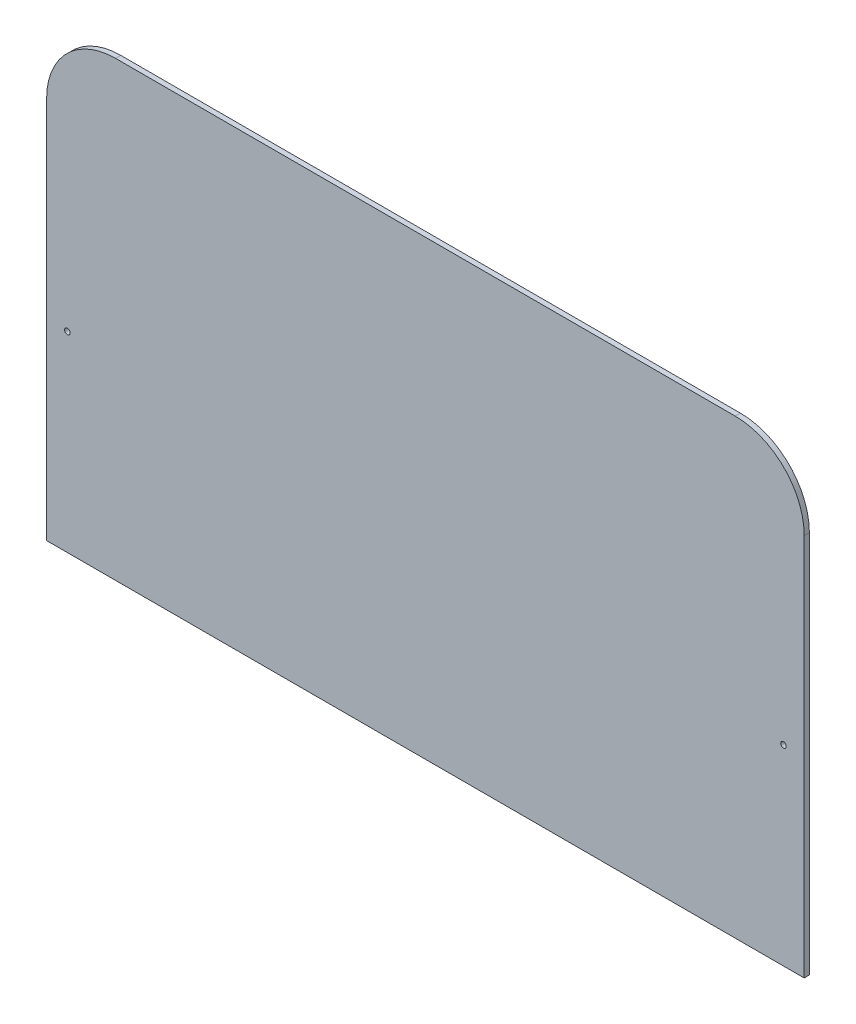
ISO-10303-21;
HEADER;
FILE_DESCRIPTION(('STEP AP214'),'2;1');
FILE_NAME('part.step','',(''),(''),'','','');
FILE_SCHEMA(('AUTOMOTIVE_DESIGN { 1 0 10303 214 1 1 1 1 }'));
ENDSEC;
DATA;
#1=APPLICATION_CONTEXT('core data for automotive mechanical design processes');
#2=APPLICATION_PROTOCOL_DEFINITION('international standard','automotive_design',2000,#1);
#3=PRODUCT_CONTEXT('',#1,'mechanical');
#4=PRODUCT('Part','Part','',(#3));
#5=PRODUCT_RELATED_PRODUCT_CATEGORY('part','',(#4));
#6=PRODUCT_DEFINITION_FORMATION('','',#4);
#7=PRODUCT_DEFINITION_CONTEXT('part definition',#1,'design');
#8=PRODUCT_DEFINITION('design','',#6,#7);
#9=PRODUCT_DEFINITION_SHAPE('','',#8);
#10=(LENGTH_UNIT() NAMED_UNIT(*) SI_UNIT(.MILLI.,.METRE.));
#11=(NAMED_UNIT(*) PLANE_ANGLE_UNIT() SI_UNIT($,.RADIAN.));
#12=(NAMED_UNIT(*) SI_UNIT($,.STERADIAN.) SOLID_ANGLE_UNIT());
#13=UNCERTAINTY_MEASURE_WITH_UNIT(LENGTH_MEASURE(1.E-05),#10,'distance_accuracy_value','');
#14=(GEOMETRIC_REPRESENTATION_CONTEXT(3) GLOBAL_UNCERTAINTY_ASSIGNED_CONTEXT((#13)) GLOBAL_UNIT_ASSIGNED_CONTEXT((#10,
#11,#12)) REPRESENTATION_CONTEXT('',''));
#15=CARTESIAN_POINT('',(0.,0.,0.));
#16=DIRECTION('',(0.,0.,1.));
#17=DIRECTION('',(1.,0.,0.));
#18=AXIS2_PLACEMENT_3D('',#15,#16,#17);
#19=CARTESIAN_POINT('',(-219.5,-131.,3.));
#20=DIRECTION('',(1.,0.,0.));
#21=DIRECTION('',(0.,0.,-1.));
#22=AXIS2_PLACEMENT_3D('',#19,#20,#21);
#23=PLANE('',#22);
#24=DIRECTION('',(0.,-1.,0.));
#25=VECTOR('',#24,1.);
#26=CARTESIAN_POINT('',(-219.5,-131.,3.));
#27=LINE('',#26,#25);
#28=CARTESIAN_POINT('',(-219.5,91.0000000000001,3.));
#29=VERTEX_POINT('',#28);
#30=CARTESIAN_POINT('',(-219.5,-131.,3.));
#31=VERTEX_POINT('',#30);
#32=EDGE_CURVE('E86',#29,#31,#27,.T.);
#33=ORIENTED_EDGE('',*,*,#32,.F.);
#34=DIRECTION('',(0.,0.,-1.));
#35=VECTOR('',#34,1.);
#36=CARTESIAN_POINT('',(-219.5,91.0000000000001,3.));
#37=LINE('',#36,#35);
#38=CARTESIAN_POINT('',(-219.5,91.0000000000001,0.));
#39=VERTEX_POINT('',#38);
#40=EDGE_CURVE('E11',#29,#39,#37,.T.);
#41=ORIENTED_EDGE('',*,*,#40,.T.);
#42=DIRECTION('',(0.,-1.,0.));
#43=VECTOR('',#42,1.);
#44=CARTESIAN_POINT('',(-219.5,-131.,0.));
#45=LINE('',#44,#43);
#46=CARTESIAN_POINT('',(-219.5,-131.,0.));
#47=VERTEX_POINT('',#46);
#48=EDGE_CURVE('E105',#39,#47,#45,.T.);
#49=ORIENTED_EDGE('',*,*,#48,.T.);
#50=DIRECTION('',(0.,0.,-1.));
#51=VECTOR('',#50,1.);
#52=CARTESIAN_POINT('',(-219.5,-131.,3.));
#53=LINE('',#52,#51);
#54=EDGE_CURVE('E99',#31,#47,#53,.T.);
#55=ORIENTED_EDGE('',*,*,#54,.F.);
#56=EDGE_LOOP('',(#33,#41,#49,#55));
#57=FACE_BOUND('',#56,.T.);
#58=ADVANCED_FACE('F33',(#57),#23,.F.);
#59=CARTESIAN_POINT('',(219.5,-131.,3.));
#60=DIRECTION('',(0.,1.,0.));
#61=DIRECTION('',(0.,0.,1.));
#62=AXIS2_PLACEMENT_3D('',#59,#60,#61);
#63=PLANE('',#62);
#64=DIRECTION('',(1.,0.,0.));
#65=VECTOR('',#64,1.);
#66=CARTESIAN_POINT('',(219.5,-131.,0.));
#67=LINE('',#66,#65);
#68=CARTESIAN_POINT('',(219.5,-131.,0.));
#69=VERTEX_POINT('',#68);
#70=EDGE_CURVE('E138',#47,#69,#67,.T.);
#71=ORIENTED_EDGE('',*,*,#70,.T.);
#72=DIRECTION('',(0.,0.,-1.));
#73=VECTOR('',#72,1.);
#74=CARTESIAN_POINT('',(219.5,-131.,3.));
#75=LINE('',#74,#73);
#76=CARTESIAN_POINT('',(219.5,-131.,3.));
#77=VERTEX_POINT('',#76);
#78=EDGE_CURVE('E101',#77,#69,#75,.T.);
#79=ORIENTED_EDGE('',*,*,#78,.F.);
#80=DIRECTION('',(1.,0.,0.));
#81=VECTOR('',#80,1.);
#82=CARTESIAN_POINT('',(219.5,-131.,3.));
#83=LINE('',#82,#81);
#84=EDGE_CURVE('E89',#31,#77,#83,.T.);
#85=ORIENTED_EDGE('',*,*,#84,.F.);
#86=ORIENTED_EDGE('',*,*,#54,.T.);
#87=EDGE_LOOP('',(#71,#79,#85,#86));
#88=FACE_BOUND('',#87,.T.);
#89=ADVANCED_FACE('F98',(#88),#63,.F.);
#90=CARTESIAN_POINT('',(219.5,-131.,3.));
#91=DIRECTION('',(-1.,0.,0.));
#92=DIRECTION('',(0.,0.,1.));
#93=AXIS2_PLACEMENT_3D('',#90,#91,#92);
#94=PLANE('',#93);
#95=DIRECTION('',(0.,1.,0.));
#96=VECTOR('',#95,1.);
#97=CARTESIAN_POINT('',(219.5,-131.,0.));
#98=LINE('',#97,#96);
#99=CARTESIAN_POINT('',(219.5,91.0000000000001,0.));
#100=VERTEX_POINT('',#99);
#101=EDGE_CURVE('E136',#69,#100,#98,.T.);
#102=ORIENTED_EDGE('',*,*,#101,.T.);
#103=DIRECTION('',(0.,0.,-1.));
#104=VECTOR('',#103,1.);
#105=CARTESIAN_POINT('',(219.5,91.0000000000001,3.));
#106=LINE('',#105,#104);
#107=CARTESIAN_POINT('',(219.5,91.0000000000001,3.));
#108=VERTEX_POINT('',#107);
#109=EDGE_CURVE('E56',#100,#108,#106,.F.);
#110=ORIENTED_EDGE('',*,*,#109,.T.);
#111=DIRECTION('',(0.,1.,0.));
#112=VECTOR('',#111,1.);
#113=CARTESIAN_POINT('',(219.5,-131.,3.));
#114=LINE('',#113,#112);
#115=EDGE_CURVE('E102',#77,#108,#114,.T.);
#116=ORIENTED_EDGE('',*,*,#115,.F.);
#117=ORIENTED_EDGE('',*,*,#78,.T.);
#118=EDGE_LOOP('',(#102,#110,#116,#117));
#119=FACE_BOUND('',#118,.T.);
#120=ADVANCED_FACE('F137',(#119),#94,.F.);
#121=CARTESIAN_POINT('',(219.5,131.,3.));
#122=DIRECTION('',(0.,-1.,0.));
#123=DIRECTION('',(0.,0.,-1.));
#124=AXIS2_PLACEMENT_3D('',#121,#122,#123);
#125=PLANE('',#124);
#126=DIRECTION('',(-1.,0.,0.));
#127=VECTOR('',#126,1.);
#128=CARTESIAN_POINT('',(219.5,131.,3.));
#129=LINE('',#128,#127);
#130=CARTESIAN_POINT('',(179.5,131.,3.));
#131=VERTEX_POINT('',#130);
#132=CARTESIAN_POINT('',(-179.5,131.,3.));
#133=VERTEX_POINT('',#132);
#134=EDGE_CURVE('E111',#131,#133,#129,.T.);
#135=ORIENTED_EDGE('',*,*,#134,.F.);
#136=DIRECTION('',(0.,0.,-1.));
#137=VECTOR('',#136,1.);
#138=CARTESIAN_POINT('',(179.5,131.,3.));
#139=LINE('',#138,#137);
#140=CARTESIAN_POINT('',(179.5,131.,0.));
#141=VERTEX_POINT('',#140);
#142=EDGE_CURVE('E109',#131,#141,#139,.T.);
#143=ORIENTED_EDGE('',*,*,#142,.T.);
#144=DIRECTION('',(-1.,0.,0.));
#145=VECTOR('',#144,1.);
#146=CARTESIAN_POINT('',(219.5,131.,0.));
#147=LINE('',#146,#145);
#148=CARTESIAN_POINT('',(-179.5,131.,0.));
#149=VERTEX_POINT('',#148);
#150=EDGE_CURVE('E94',#141,#149,#147,.T.);
#151=ORIENTED_EDGE('',*,*,#150,.T.);
#152=DIRECTION('',(0.,0.,-1.));
#153=VECTOR('',#152,1.);
#154=CARTESIAN_POINT('',(-179.5,131.,3.));
#155=LINE('',#154,#153);
#156=EDGE_CURVE('E107',#149,#133,#155,.F.);
#157=ORIENTED_EDGE('',*,*,#156,.T.);
#158=EDGE_LOOP('',(#135,#143,#151,#157));
#159=FACE_BOUND('',#158,.T.);
#160=ADVANCED_FACE('F127',(#159),#125,.F.);
#161=CARTESIAN_POINT('',(0.,0.,3.));
#162=DIRECTION('',(0.,0.,1.));
#163=DIRECTION('',(1.,0.,0.));
#164=AXIS2_PLACEMENT_3D('',#161,#162,#163);
#165=PLANE('',#164);
#166=CARTESIAN_POINT('',(207.499999999999,-20.0000000000001,3.));
#167=DIRECTION('',(0.,0.,1.));
#168=DIRECTION('',(1.,0.,0.));
#169=AXIS2_PLACEMENT_3D('',#166,#167,#168);
#170=CIRCLE('',#169,1.59999999999976);
#171=CARTESIAN_POINT('',(209.099999999999,-20.0000000000001,3.));
#172=VERTEX_POINT('',#171);
#173=EDGE_CURVE('E151',#172,#172,#170,.T.);
#174=ORIENTED_EDGE('',*,*,#173,.F.);
#175=EDGE_LOOP('',(#174));
#176=FACE_BOUND('',#175,.T.);
#177=CARTESIAN_POINT('',(-207.5,-20.0000000000001,3.));
#178=DIRECTION('',(0.,0.,1.));
#179=DIRECTION('',(1.,0.,0.));
#180=AXIS2_PLACEMENT_3D('',#177,#178,#179);
#181=CIRCLE('',#180,1.59999999999999);
#182=CARTESIAN_POINT('',(-205.9,-20.0000000000001,3.));
#183=VERTEX_POINT('',#182);
#184=EDGE_CURVE('E145',#183,#183,#181,.T.);
#185=ORIENTED_EDGE('',*,*,#184,.F.);
#186=EDGE_LOOP('',(#185));
#187=FACE_BOUND('',#186,.T.);
#188=ORIENTED_EDGE('',*,*,#115,.T.);
#189=CARTESIAN_POINT('',(179.5,91.0000000000001,3.));
#190=DIRECTION('',(0.,0.,1.));
#191=DIRECTION('',(1.,0.,0.));
#192=AXIS2_PLACEMENT_3D('',#189,#190,#191);
#193=CIRCLE('',#192,40.);
#194=EDGE_CURVE('E41',#108,#131,#193,.T.);
#195=ORIENTED_EDGE('',*,*,#194,.T.);
#196=ORIENTED_EDGE('',*,*,#134,.T.);
#197=CARTESIAN_POINT('',(-179.5,91.0000000000001,3.));
#198=DIRECTION('',(0.,0.,1.));
#199=DIRECTION('',(1.,0.,0.));
#200=AXIS2_PLACEMENT_3D('',#197,#198,#199);
#201=CIRCLE('',#200,40.);
#202=EDGE_CURVE('E48',#133,#29,#201,.T.);
#203=ORIENTED_EDGE('',*,*,#202,.T.);
#204=ORIENTED_EDGE('',*,*,#32,.T.);
#205=ORIENTED_EDGE('',*,*,#84,.T.);
#206=EDGE_LOOP('',(#188,#195,#196,#203,#204,#205));
#207=FACE_BOUND('',#206,.T.);
#208=ADVANCED_FACE('F88',(#176,#187,#207),#165,.T.);
#209=CARTESIAN_POINT('',(0.,0.,0.));
#210=DIRECTION('',(0.,0.,1.));
#211=DIRECTION('',(1.,0.,0.));
#212=AXIS2_PLACEMENT_3D('',#209,#210,#211);
#213=PLANE('',#212);
#214=CARTESIAN_POINT('',(207.499999999999,-20.0000000000001,0.));
#215=DIRECTION('',(0.,0.,1.));
#216=DIRECTION('',(1.,0.,0.));
#217=AXIS2_PLACEMENT_3D('',#214,#215,#216);
#218=CIRCLE('',#217,1.59999999999976);
#219=CARTESIAN_POINT('',(209.099999999999,-20.0000000000001,0.));
#220=VERTEX_POINT('',#219);
#221=EDGE_CURVE('E148',#220,#220,#218,.T.);
#222=ORIENTED_EDGE('',*,*,#221,.T.);
#223=EDGE_LOOP('',(#222));
#224=FACE_BOUND('',#223,.T.);
#225=CARTESIAN_POINT('',(-207.5,-20.0000000000001,0.));
#226=DIRECTION('',(0.,0.,1.));
#227=DIRECTION('',(1.,0.,0.));
#228=AXIS2_PLACEMENT_3D('',#225,#226,#227);
#229=CIRCLE('',#228,1.59999999999999);
#230=CARTESIAN_POINT('',(-205.9,-20.0000000000001,0.));
#231=VERTEX_POINT('',#230);
#232=EDGE_CURVE('E142',#231,#231,#229,.T.);
#233=ORIENTED_EDGE('',*,*,#232,.T.);
#234=EDGE_LOOP('',(#233));
#235=FACE_BOUND('',#234,.T.);
#236=ORIENTED_EDGE('',*,*,#150,.F.);
#237=CARTESIAN_POINT('',(179.5,91.0000000000001,0.));
#238=DIRECTION('',(0.,0.,1.));
#239=DIRECTION('',(1.,0.,0.));
#240=AXIS2_PLACEMENT_3D('',#237,#238,#239);
#241=CIRCLE('',#240,40.);
#242=EDGE_CURVE('E119',#141,#100,#241,.F.);
#243=ORIENTED_EDGE('',*,*,#242,.T.);
#244=ORIENTED_EDGE('',*,*,#101,.F.);
#245=ORIENTED_EDGE('',*,*,#70,.F.);
#246=ORIENTED_EDGE('',*,*,#48,.F.);
#247=CARTESIAN_POINT('',(-179.5,91.0000000000001,0.));
#248=DIRECTION('',(0.,0.,1.));
#249=DIRECTION('',(1.,0.,0.));
#250=AXIS2_PLACEMENT_3D('',#247,#248,#249);
#251=CIRCLE('',#250,40.);
#252=EDGE_CURVE('E117',#39,#149,#251,.F.);
#253=ORIENTED_EDGE('',*,*,#252,.T.);
#254=EDGE_LOOP('',(#236,#243,#244,#245,#246,#253));
#255=FACE_BOUND('',#254,.T.);
#256=ADVANCED_FACE('F135',(#224,#235,#255),#213,.F.);
#257=CARTESIAN_POINT('',(179.5,91.0000000000001,3.));
#258=DIRECTION('',(0.,0.,-1.));
#259=DIRECTION('',(-1.,0.,0.));
#260=AXIS2_PLACEMENT_3D('',#257,#258,#259);
#261=CYLINDRICAL_SURFACE('',#260,40.);
#262=ORIENTED_EDGE('',*,*,#194,.F.);
#263=ORIENTED_EDGE('',*,*,#109,.F.);
#264=ORIENTED_EDGE('',*,*,#242,.F.);
#265=ORIENTED_EDGE('',*,*,#142,.F.);
#266=EDGE_LOOP('',(#262,#263,#264,#265));
#267=FACE_BOUND('',#266,.T.);
#268=ADVANCED_FACE('F132',(#267),#261,.T.);
#269=CARTESIAN_POINT('',(-179.5,91.0000000000001,3.));
#270=DIRECTION('',(0.,0.,-1.));
#271=DIRECTION('',(-1.,0.,0.));
#272=AXIS2_PLACEMENT_3D('',#269,#270,#271);
#273=CYLINDRICAL_SURFACE('',#272,40.);
#274=ORIENTED_EDGE('',*,*,#202,.F.);
#275=ORIENTED_EDGE('',*,*,#156,.F.);
#276=ORIENTED_EDGE('',*,*,#252,.F.);
#277=ORIENTED_EDGE('',*,*,#40,.F.);
#278=EDGE_LOOP('',(#274,#275,#276,#277));
#279=FACE_BOUND('',#278,.T.);
#280=ADVANCED_FACE('F35',(#279),#273,.T.);
#281=CARTESIAN_POINT('',(-207.5,-20.0000000000001,0.));
#282=DIRECTION('',(0.,0.,1.));
#283=DIRECTION('',(1.,0.,0.));
#284=AXIS2_PLACEMENT_3D('',#281,#282,#283);
#285=CYLINDRICAL_SURFACE('',#284,1.59999999999999);
#286=ORIENTED_EDGE('',*,*,#232,.F.);
#287=EDGE_LOOP('',(#286));
#288=FACE_BOUND('',#287,.T.);
#289=ORIENTED_EDGE('',*,*,#184,.T.);
#290=EDGE_LOOP('',(#289));
#291=FACE_BOUND('',#290,.T.);
#292=ADVANCED_FACE('F162',(#288,#291),#285,.F.);
#293=CARTESIAN_POINT('',(207.499999999999,-20.0000000000001,0.));
#294=DIRECTION('',(0.,0.,1.));
#295=DIRECTION('',(1.,0.,0.));
#296=AXIS2_PLACEMENT_3D('',#293,#294,#295);
#297=CYLINDRICAL_SURFACE('',#296,1.59999999999976);
#298=ORIENTED_EDGE('',*,*,#221,.F.);
#299=EDGE_LOOP('',(#298));
#300=FACE_BOUND('',#299,.T.);
#301=ORIENTED_EDGE('',*,*,#173,.T.);
#302=EDGE_LOOP('',(#301));
#303=FACE_BOUND('',#302,.T.);
#304=ADVANCED_FACE('F159',(#300,#303),#297,.F.);
#305=CLOSED_SHELL('',(#58,#89,#120,#160,#208,#256,#268,#280,#292,#304));
#306=MANIFOLD_SOLID_BREP('B2',#305);
#307=ADVANCED_BREP_SHAPE_REPRESENTATION('',(#18,#306),#14);
#308=SHAPE_DEFINITION_REPRESENTATION(#9,#307);
ENDSEC;
END-ISO-10303-21;
